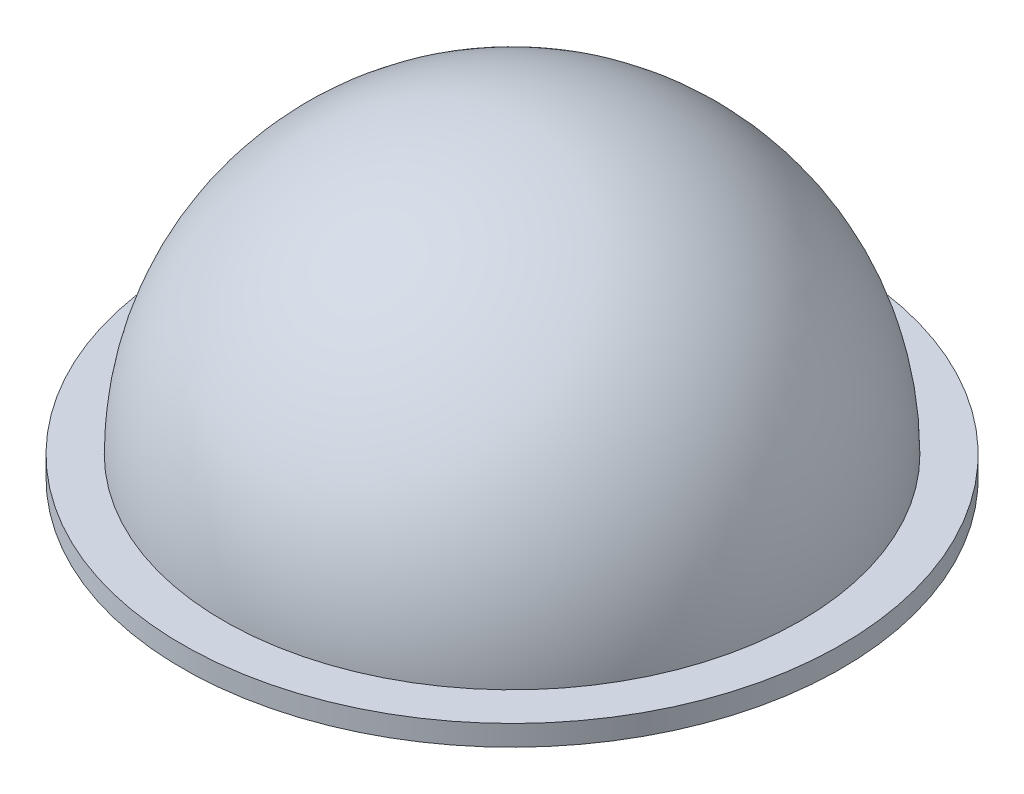
ISO-10303-21;
HEADER;
FILE_DESCRIPTION(('STEP AP214'),'2;1');
FILE_NAME('part.step','',(''),(''),'','','');
FILE_SCHEMA(('AUTOMOTIVE_DESIGN { 1 0 10303 214 1 1 1 1 }'));
ENDSEC;
DATA;
#1=APPLICATION_CONTEXT('core data for automotive mechanical design processes');
#2=APPLICATION_PROTOCOL_DEFINITION('international standard','automotive_design',2000,#1);
#3=PRODUCT_CONTEXT('',#1,'mechanical');
#4=PRODUCT('Part','Part','',(#3));
#5=PRODUCT_RELATED_PRODUCT_CATEGORY('part','',(#4));
#6=PRODUCT_DEFINITION_FORMATION('','',#4);
#7=PRODUCT_DEFINITION_CONTEXT('part definition',#1,'design');
#8=PRODUCT_DEFINITION('design','',#6,#7);
#9=PRODUCT_DEFINITION_SHAPE('','',#8);
#10=(LENGTH_UNIT() NAMED_UNIT(*) SI_UNIT(.MILLI.,.METRE.));
#11=(NAMED_UNIT(*) PLANE_ANGLE_UNIT() SI_UNIT($,.RADIAN.));
#12=(NAMED_UNIT(*) SI_UNIT($,.STERADIAN.) SOLID_ANGLE_UNIT());
#13=UNCERTAINTY_MEASURE_WITH_UNIT(LENGTH_MEASURE(1.E-05),#10,'distance_accuracy_value','');
#14=(GEOMETRIC_REPRESENTATION_CONTEXT(3) GLOBAL_UNCERTAINTY_ASSIGNED_CONTEXT((#13)) GLOBAL_UNIT_ASSIGNED_CONTEXT((#10,
#11,#12)) REPRESENTATION_CONTEXT('',''));
#15=CARTESIAN_POINT('',(0.,0.,0.));
#16=DIRECTION('',(0.,0.,1.));
#17=DIRECTION('',(1.,0.,0.));
#18=AXIS2_PLACEMENT_3D('',#15,#16,#17);
#19=CARTESIAN_POINT('',(0.,3.,0.));
#20=DIRECTION('',(0.,-1.,0.));
#21=DIRECTION('',(0.,0.,-1.));
#22=AXIS2_PLACEMENT_3D('',#19,#20,#21);
#23=CONICAL_SURFACE('',#22,82.55,0.785398163397449);
#24=CARTESIAN_POINT('',(0.,0.,0.));
#25=DIRECTION('',(0.,-1.,0.));
#26=DIRECTION('',(0.,0.,-1.));
#27=AXIS2_PLACEMENT_3D('',#24,#25,#26);
#28=CIRCLE('',#27,85.55);
#29=CARTESIAN_POINT('',(0.,0.,-85.55));
#30=VERTEX_POINT('',#29);
#31=EDGE_CURVE('E10',#30,#30,#28,.T.);
#32=ORIENTED_EDGE('',*,*,#31,.T.);
#33=EDGE_LOOP('',(#32));
#34=FACE_BOUND('',#33,.T.);
#35=CARTESIAN_POINT('',(0.,3.,0.));
#36=DIRECTION('',(0.,-1.,0.));
#37=DIRECTION('',(0.,0.,-1.));
#38=AXIS2_PLACEMENT_3D('',#35,#36,#37);
#39=CIRCLE('',#38,82.55);
#40=CARTESIAN_POINT('',(0.,3.,-82.55));
#41=VERTEX_POINT('',#40);
#42=EDGE_CURVE('E53',#41,#41,#39,.T.);
#43=ORIENTED_EDGE('',*,*,#42,.F.);
#44=EDGE_LOOP('',(#43));
#45=FACE_BOUND('',#44,.T.);
#46=ADVANCED_FACE('F31',(#34,#45),#23,.F.);
#47=CARTESIAN_POINT('',(85.55,0.,0.));
#48=DIRECTION('',(0.,-1.,0.));
#49=DIRECTION('',(0.,0.,-1.));
#50=AXIS2_PLACEMENT_3D('',#47,#48,#49);
#51=PLANE('',#50);
#52=CARTESIAN_POINT('',(0.,0.,0.));
#53=DIRECTION('',(0.,-1.,0.));
#54=DIRECTION('',(0.,0.,-1.));
#55=AXIS2_PLACEMENT_3D('',#52,#53,#54);
#56=CIRCLE('',#55,101.6);
#57=CARTESIAN_POINT('',(0.,0.,-101.6));
#58=VERTEX_POINT('',#57);
#59=EDGE_CURVE('E37',#58,#58,#56,.T.);
#60=ORIENTED_EDGE('',*,*,#59,.T.);
#61=EDGE_LOOP('',(#60));
#62=FACE_BOUND('',#61,.T.);
#63=ORIENTED_EDGE('',*,*,#31,.F.);
#64=EDGE_LOOP('',(#63));
#65=FACE_BOUND('',#64,.T.);
#66=ADVANCED_FACE('F61',(#62,#65),#51,.T.);
#67=CARTESIAN_POINT('',(0.,0.,0.));
#68=DIRECTION('',(0.,-1.,0.));
#69=DIRECTION('',(0.,0.,-1.));
#70=AXIS2_PLACEMENT_3D('',#67,#68,#69);
#71=CYLINDRICAL_SURFACE('',#70,101.6);
#72=CARTESIAN_POINT('',(0.,6.34999999999998,0.));
#73=DIRECTION('',(0.,-1.,0.));
#74=DIRECTION('',(0.,0.,-1.));
#75=AXIS2_PLACEMENT_3D('',#72,#73,#74);
#76=CIRCLE('',#75,101.6);
#77=CARTESIAN_POINT('',(0.,6.34999999999998,-101.6));
#78=VERTEX_POINT('',#77);
#79=EDGE_CURVE('E41',#78,#78,#76,.T.);
#80=ORIENTED_EDGE('',*,*,#79,.T.);
#81=EDGE_LOOP('',(#80));
#82=FACE_BOUND('',#81,.T.);
#83=ORIENTED_EDGE('',*,*,#59,.F.);
#84=EDGE_LOOP('',(#83));
#85=FACE_BOUND('',#84,.T.);
#86=ADVANCED_FACE('F65',(#82,#85),#71,.T.);
#87=CARTESIAN_POINT('',(101.6,6.35000000000001,0.));
#88=DIRECTION('',(0.,1.,0.));
#89=DIRECTION('',(0.,0.,1.));
#90=AXIS2_PLACEMENT_3D('',#87,#88,#89);
#91=PLANE('',#90);
#92=CARTESIAN_POINT('',(0.,6.35000000000003,0.));
#93=DIRECTION('',(0.,-1.,0.));
#94=DIRECTION('',(0.,0.,-1.));
#95=AXIS2_PLACEMENT_3D('',#92,#93,#94);
#96=CIRCLE('',#95,88.9);
#97=CARTESIAN_POINT('',(0.,6.35000000000003,-88.9));
#98=VERTEX_POINT('',#97);
#99=EDGE_CURVE('E45',#98,#98,#96,.T.);
#100=ORIENTED_EDGE('',*,*,#99,.T.);
#101=EDGE_LOOP('',(#100));
#102=FACE_BOUND('',#101,.T.);
#103=ORIENTED_EDGE('',*,*,#79,.F.);
#104=EDGE_LOOP('',(#103));
#105=FACE_BOUND('',#104,.T.);
#106=ADVANCED_FACE('F69',(#102,#105),#91,.T.);
#107=CARTESIAN_POINT('',(0.,6.34999999999997,0.));
#108=DIRECTION('',(0.,-1.,0.));
#109=DIRECTION('',(1.,0.,0.));
#110=AXIS2_PLACEMENT_3D('',#107,#108,#109);
#111=SPHERICAL_SURFACE('',#110,88.9);
#112=ORIENTED_EDGE('',*,*,#99,.F.);
#113=EDGE_LOOP('',(#112));
#114=FACE_BOUND('',#113,.T.);
#115=ADVANCED_FACE('F76',(#114),#111,.T.);
#116=CARTESIAN_POINT('',(0.,6.34999999999997,0.));
#117=DIRECTION('',(0.,-1.,0.));
#118=DIRECTION('',(1.,0.,0.));
#119=AXIS2_PLACEMENT_3D('',#116,#117,#118);
#120=SPHERICAL_SURFACE('',#119,82.55);
#121=CARTESIAN_POINT('',(0.,6.35000000000003,0.));
#122=DIRECTION('',(0.,-1.,0.));
#123=DIRECTION('',(0.,0.,-1.));
#124=AXIS2_PLACEMENT_3D('',#121,#122,#123);
#125=CIRCLE('',#124,82.55);
#126=CARTESIAN_POINT('',(0.,6.35000000000003,-82.55));
#127=VERTEX_POINT('',#126);
#128=EDGE_CURVE('E50',#127,#127,#125,.T.);
#129=ORIENTED_EDGE('',*,*,#128,.T.);
#130=EDGE_LOOP('',(#129));
#131=FACE_BOUND('',#130,.T.);
#132=ADVANCED_FACE('F80',(#131),#120,.F.);
#133=CARTESIAN_POINT('',(0.,0.,0.));
#134=DIRECTION('',(0.,-1.,0.));
#135=DIRECTION('',(0.,0.,-1.));
#136=AXIS2_PLACEMENT_3D('',#133,#134,#135);
#137=CYLINDRICAL_SURFACE('',#136,82.55);
#138=ORIENTED_EDGE('',*,*,#42,.T.);
#139=EDGE_LOOP('',(#138));
#140=FACE_BOUND('',#139,.T.);
#141=ORIENTED_EDGE('',*,*,#128,.F.);
#142=EDGE_LOOP('',(#141));
#143=FACE_BOUND('',#142,.T.);
#144=ADVANCED_FACE('F57',(#140,#143),#137,.F.);
#145=CLOSED_SHELL('',(#46,#66,#86,#106,#115,#132,#144));
#146=MANIFOLD_SOLID_BREP('B2',#145);
#147=ADVANCED_BREP_SHAPE_REPRESENTATION('',(#18,#146),#14);
#148=SHAPE_DEFINITION_REPRESENTATION(#9,#147);
ENDSEC;
END-ISO-10303-21;
